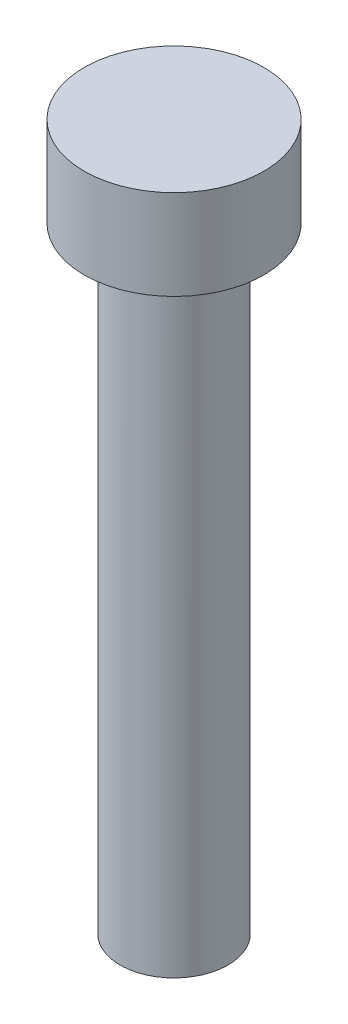
ISO-10303-21;
HEADER;
FILE_DESCRIPTION(('STEP AP214'),'2;1');
FILE_NAME('part.step','',(''),(''),'','','');
FILE_SCHEMA(('AUTOMOTIVE_DESIGN { 1 0 10303 214 1 1 1 1 }'));
ENDSEC;
DATA;
#1=APPLICATION_CONTEXT('core data for automotive mechanical design processes');
#2=APPLICATION_PROTOCOL_DEFINITION('international standard','automotive_design',2000,#1);
#3=PRODUCT_CONTEXT('',#1,'mechanical');
#4=PRODUCT('Part','Part','',(#3));
#5=PRODUCT_RELATED_PRODUCT_CATEGORY('part','',(#4));
#6=PRODUCT_DEFINITION_FORMATION('','',#4);
#7=PRODUCT_DEFINITION_CONTEXT('part definition',#1,'design');
#8=PRODUCT_DEFINITION('design','',#6,#7);
#9=PRODUCT_DEFINITION_SHAPE('','',#8);
#10=(LENGTH_UNIT() NAMED_UNIT(*) SI_UNIT(.MILLI.,.METRE.));
#11=(NAMED_UNIT(*) PLANE_ANGLE_UNIT() SI_UNIT($,.RADIAN.));
#12=(NAMED_UNIT(*) SI_UNIT($,.STERADIAN.) SOLID_ANGLE_UNIT());
#13=UNCERTAINTY_MEASURE_WITH_UNIT(LENGTH_MEASURE(1.E-05),#10,'distance_accuracy_value','');
#14=(GEOMETRIC_REPRESENTATION_CONTEXT(3) GLOBAL_UNCERTAINTY_ASSIGNED_CONTEXT((#13)) GLOBAL_UNIT_ASSIGNED_CONTEXT((#10,
#11,#12)) REPRESENTATION_CONTEXT('',''));
#15=CARTESIAN_POINT('',(0.,0.,0.));
#16=DIRECTION('',(0.,0.,1.));
#17=DIRECTION('',(1.,0.,0.));
#18=AXIS2_PLACEMENT_3D('',#15,#16,#17);
#19=CARTESIAN_POINT('',(0.,29.718,0.));
#20=DIRECTION('',(0.,-1.,0.));
#21=DIRECTION('',(0.,0.,-1.));
#22=AXIS2_PLACEMENT_3D('',#19,#20,#21);
#23=CYLINDRICAL_SURFACE('',#22,3.048);
#24=CARTESIAN_POINT('',(0.,29.718,0.));
#25=DIRECTION('',(0.,1.,0.));
#26=DIRECTION('',(0.,0.,1.));
#27=AXIS2_PLACEMENT_3D('',#24,#25,#26);
#28=CIRCLE('',#27,3.048);
#29=CARTESIAN_POINT('',(0.,29.718,3.048));
#30=VERTEX_POINT('',#29);
#31=EDGE_CURVE('E10',#30,#30,#28,.T.);
#32=ORIENTED_EDGE('',*,*,#31,.F.);
#33=EDGE_LOOP('',(#32));
#34=FACE_BOUND('',#33,.T.);
#35=CARTESIAN_POINT('',(0.,-5.08,0.));
#36=DIRECTION('',(0.,-1.,0.));
#37=DIRECTION('',(0.,0.,-1.));
#38=AXIS2_PLACEMENT_3D('',#35,#36,#37);
#39=CIRCLE('',#38,3.048);
#40=CARTESIAN_POINT('',(0.,-5.08,-3.048));
#41=VERTEX_POINT('',#40);
#42=EDGE_CURVE('E46',#41,#41,#39,.T.);
#43=ORIENTED_EDGE('',*,*,#42,.F.);
#44=EDGE_LOOP('',(#43));
#45=FACE_BOUND('',#44,.T.);
#46=ADVANCED_FACE('F31',(#34,#45),#23,.T.);
#47=CARTESIAN_POINT('',(0.,34.798,0.));
#48=DIRECTION('',(0.,-1.,0.));
#49=DIRECTION('',(0.,0.,-1.));
#50=AXIS2_PLACEMENT_3D('',#47,#48,#49);
#51=CYLINDRICAL_SURFACE('',#50,5.08);
#52=CARTESIAN_POINT('',(0.,34.798,0.));
#53=DIRECTION('',(0.,1.,0.));
#54=DIRECTION('',(0.,0.,1.));
#55=AXIS2_PLACEMENT_3D('',#52,#53,#54);
#56=CIRCLE('',#55,5.08);
#57=CARTESIAN_POINT('',(0.,34.798,5.08));
#58=VERTEX_POINT('',#57);
#59=EDGE_CURVE('E37',#58,#58,#56,.T.);
#60=ORIENTED_EDGE('',*,*,#59,.F.);
#61=EDGE_LOOP('',(#60));
#62=FACE_BOUND('',#61,.T.);
#63=CARTESIAN_POINT('',(0.,29.718,0.));
#64=DIRECTION('',(0.,1.,0.));
#65=DIRECTION('',(0.,0.,1.));
#66=AXIS2_PLACEMENT_3D('',#63,#64,#65);
#67=CIRCLE('',#66,5.08);
#68=CARTESIAN_POINT('',(0.,29.718,5.08));
#69=VERTEX_POINT('',#68);
#70=EDGE_CURVE('E41',#69,#69,#67,.T.);
#71=ORIENTED_EDGE('',*,*,#70,.T.);
#72=EDGE_LOOP('',(#71));
#73=FACE_BOUND('',#72,.T.);
#74=ADVANCED_FACE('F54',(#62,#73),#51,.T.);
#75=CARTESIAN_POINT('',(0.,34.798,0.));
#76=DIRECTION('',(0.,1.,0.));
#77=DIRECTION('',(0.,0.,1.));
#78=AXIS2_PLACEMENT_3D('',#75,#76,#77);
#79=PLANE('',#78);
#80=ORIENTED_EDGE('',*,*,#59,.T.);
#81=EDGE_LOOP('',(#80));
#82=FACE_BOUND('',#81,.T.);
#83=ADVANCED_FACE('F61',(#82),#79,.T.);
#84=CARTESIAN_POINT('',(0.,29.718,0.));
#85=DIRECTION('',(0.,1.,0.));
#86=DIRECTION('',(0.,0.,1.));
#87=AXIS2_PLACEMENT_3D('',#84,#85,#86);
#88=PLANE('',#87);
#89=ORIENTED_EDGE('',*,*,#31,.T.);
#90=EDGE_LOOP('',(#89));
#91=FACE_BOUND('',#90,.T.);
#92=ORIENTED_EDGE('',*,*,#70,.F.);
#93=EDGE_LOOP('',(#92));
#94=FACE_BOUND('',#93,.T.);
#95=ADVANCED_FACE('F66',(#91,#94),#88,.F.);
#96=CARTESIAN_POINT('',(0.,-5.08,0.));
#97=DIRECTION('',(0.,-1.,0.));
#98=DIRECTION('',(0.,0.,-1.));
#99=AXIS2_PLACEMENT_3D('',#96,#97,#98);
#100=PLANE('',#99);
#101=ORIENTED_EDGE('',*,*,#42,.T.);
#102=EDGE_LOOP('',(#101));
#103=FACE_BOUND('',#102,.T.);
#104=ADVANCED_FACE('F51',(#103),#100,.T.);
#105=CLOSED_SHELL('',(#46,#74,#83,#95,#104));
#106=MANIFOLD_SOLID_BREP('B2',#105);
#107=ADVANCED_BREP_SHAPE_REPRESENTATION('',(#18,#106),#14);
#108=SHAPE_DEFINITION_REPRESENTATION(#9,#107);
ENDSEC;
END-ISO-10303-21;
